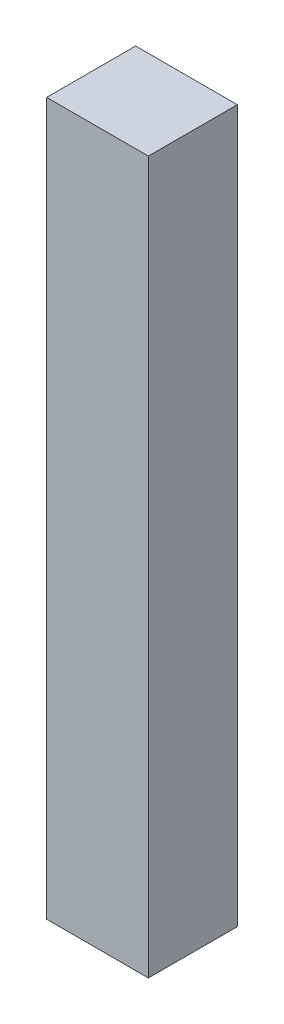
ISO-10303-21;
HEADER;
FILE_DESCRIPTION(('STEP AP214'),'2;1');
FILE_NAME('part.step','',(''),(''),'','','');
FILE_SCHEMA(('AUTOMOTIVE_DESIGN { 1 0 10303 214 1 1 1 1 }'));
ENDSEC;
DATA;
#1=APPLICATION_CONTEXT('core data for automotive mechanical design processes');
#2=APPLICATION_PROTOCOL_DEFINITION('international standard','automotive_design',2000,#1);
#3=PRODUCT_CONTEXT('',#1,'mechanical');
#4=PRODUCT('Part','Part','',(#3));
#5=PRODUCT_RELATED_PRODUCT_CATEGORY('part','',(#4));
#6=PRODUCT_DEFINITION_FORMATION('','',#4);
#7=PRODUCT_DEFINITION_CONTEXT('part definition',#1,'design');
#8=PRODUCT_DEFINITION('design','',#6,#7);
#9=PRODUCT_DEFINITION_SHAPE('','',#8);
#10=(LENGTH_UNIT() NAMED_UNIT(*) SI_UNIT(.MILLI.,.METRE.));
#11=(NAMED_UNIT(*) PLANE_ANGLE_UNIT() SI_UNIT($,.RADIAN.));
#12=(NAMED_UNIT(*) SI_UNIT($,.STERADIAN.) SOLID_ANGLE_UNIT());
#13=UNCERTAINTY_MEASURE_WITH_UNIT(LENGTH_MEASURE(1.E-05),#10,'distance_accuracy_value','');
#14=(GEOMETRIC_REPRESENTATION_CONTEXT(3) GLOBAL_UNCERTAINTY_ASSIGNED_CONTEXT((#13)) GLOBAL_UNIT_ASSIGNED_CONTEXT((#10,
#11,#12)) REPRESENTATION_CONTEXT('',''));
#15=CARTESIAN_POINT('',(0.,0.,0.));
#16=DIRECTION('',(0.,0.,1.));
#17=DIRECTION('',(1.,0.,0.));
#18=AXIS2_PLACEMENT_3D('',#15,#16,#17);
#19=CARTESIAN_POINT('',(4.,28.,-3.5));
#20=DIRECTION('',(-1.,0.,0.));
#21=DIRECTION('',(0.,0.,1.));
#22=AXIS2_PLACEMENT_3D('',#19,#20,#21);
#23=PLANE('',#22);
#24=DIRECTION('',(0.,0.,-1.));
#25=VECTOR('',#24,1.);
#26=CARTESIAN_POINT('',(4.,-28.,-3.5));
#27=LINE('',#26,#25);
#28=CARTESIAN_POINT('',(4.,-28.,3.5));
#29=VERTEX_POINT('',#28);
#30=CARTESIAN_POINT('',(4.,-28.,-3.5));
#31=VERTEX_POINT('',#30);
#32=EDGE_CURVE('E96',#29,#31,#27,.T.);
#33=ORIENTED_EDGE('',*,*,#32,.T.);
#34=DIRECTION('',(0.,-1.,0.));
#35=VECTOR('',#34,1.);
#36=CARTESIAN_POINT('',(4.,28.,-3.5));
#37=LINE('',#36,#35);
#38=CARTESIAN_POINT('',(4.,28.,-3.5));
#39=VERTEX_POINT('',#38);
#40=EDGE_CURVE('E11',#39,#31,#37,.T.);
#41=ORIENTED_EDGE('',*,*,#40,.F.);
#42=DIRECTION('',(0.,0.,-1.));
#43=VECTOR('',#42,1.);
#44=CARTESIAN_POINT('',(4.,28.,-3.5));
#45=LINE('',#44,#43);
#46=CARTESIAN_POINT('',(4.,28.,3.5));
#47=VERTEX_POINT('',#46);
#48=EDGE_CURVE('E84',#47,#39,#45,.T.);
#49=ORIENTED_EDGE('',*,*,#48,.F.);
#50=DIRECTION('',(0.,-1.,0.));
#51=VECTOR('',#50,1.);
#52=CARTESIAN_POINT('',(4.,28.,3.5));
#53=LINE('',#52,#51);
#54=EDGE_CURVE('E92',#47,#29,#53,.T.);
#55=ORIENTED_EDGE('',*,*,#54,.T.);
#56=EDGE_LOOP('',(#33,#41,#49,#55));
#57=FACE_BOUND('',#56,.T.);
#58=ADVANCED_FACE('F33',(#57),#23,.F.);
#59=CARTESIAN_POINT('',(-4.,28.,-3.5));
#60=DIRECTION('',(0.,0.,1.));
#61=DIRECTION('',(1.,0.,0.));
#62=AXIS2_PLACEMENT_3D('',#59,#60,#61);
#63=PLANE('',#62);
#64=DIRECTION('',(-1.,0.,0.));
#65=VECTOR('',#64,1.);
#66=CARTESIAN_POINT('',(-4.,-28.,-3.5));
#67=LINE('',#66,#65);
#68=CARTESIAN_POINT('',(-4.,-28.,-3.5));
#69=VERTEX_POINT('',#68);
#70=EDGE_CURVE('E88',#31,#69,#67,.T.);
#71=ORIENTED_EDGE('',*,*,#70,.T.);
#72=DIRECTION('',(0.,-1.,0.));
#73=VECTOR('',#72,1.);
#74=CARTESIAN_POINT('',(-4.,28.,-3.5));
#75=LINE('',#74,#73);
#76=CARTESIAN_POINT('',(-4.,28.,-3.5));
#77=VERTEX_POINT('',#76);
#78=EDGE_CURVE('E41',#77,#69,#75,.T.);
#79=ORIENTED_EDGE('',*,*,#78,.F.);
#80=DIRECTION('',(-1.,0.,0.));
#81=VECTOR('',#80,1.);
#82=CARTESIAN_POINT('',(-4.,28.,-3.5));
#83=LINE('',#82,#81);
#84=EDGE_CURVE('E79',#39,#77,#83,.T.);
#85=ORIENTED_EDGE('',*,*,#84,.F.);
#86=ORIENTED_EDGE('',*,*,#40,.T.);
#87=EDGE_LOOP('',(#71,#79,#85,#86));
#88=FACE_BOUND('',#87,.T.);
#89=ADVANCED_FACE('F87',(#88),#63,.F.);
#90=CARTESIAN_POINT('',(-4.,28.,-3.5));
#91=DIRECTION('',(1.,0.,0.));
#92=DIRECTION('',(0.,0.,-1.));
#93=AXIS2_PLACEMENT_3D('',#90,#91,#92);
#94=PLANE('',#93);
#95=DIRECTION('',(0.,0.,1.));
#96=VECTOR('',#95,1.);
#97=CARTESIAN_POINT('',(-4.,-28.,-3.5));
#98=LINE('',#97,#96);
#99=CARTESIAN_POINT('',(-4.,-28.,3.5));
#100=VERTEX_POINT('',#99);
#101=EDGE_CURVE('E66',#69,#100,#98,.T.);
#102=ORIENTED_EDGE('',*,*,#101,.T.);
#103=DIRECTION('',(0.,-1.,0.));
#104=VECTOR('',#103,1.);
#105=CARTESIAN_POINT('',(-4.,28.,3.5));
#106=LINE('',#105,#104);
#107=CARTESIAN_POINT('',(-4.,28.,3.5));
#108=VERTEX_POINT('',#107);
#109=EDGE_CURVE('E89',#108,#100,#106,.T.);
#110=ORIENTED_EDGE('',*,*,#109,.F.);
#111=DIRECTION('',(0.,0.,1.));
#112=VECTOR('',#111,1.);
#113=CARTESIAN_POINT('',(-4.,28.,-3.5));
#114=LINE('',#113,#112);
#115=EDGE_CURVE('E82',#77,#108,#114,.T.);
#116=ORIENTED_EDGE('',*,*,#115,.F.);
#117=ORIENTED_EDGE('',*,*,#78,.T.);
#118=EDGE_LOOP('',(#102,#110,#116,#117));
#119=FACE_BOUND('',#118,.T.);
#120=ADVANCED_FACE('F90',(#119),#94,.F.);
#121=CARTESIAN_POINT('',(-4.,28.,3.5));
#122=DIRECTION('',(0.,0.,-1.));
#123=DIRECTION('',(-1.,0.,0.));
#124=AXIS2_PLACEMENT_3D('',#121,#122,#123);
#125=PLANE('',#124);
#126=DIRECTION('',(1.,0.,0.));
#127=VECTOR('',#126,1.);
#128=CARTESIAN_POINT('',(-4.,-28.,3.5));
#129=LINE('',#128,#127);
#130=EDGE_CURVE('E72',#100,#29,#129,.T.);
#131=ORIENTED_EDGE('',*,*,#130,.T.);
#132=ORIENTED_EDGE('',*,*,#54,.F.);
#133=DIRECTION('',(1.,0.,0.));
#134=VECTOR('',#133,1.);
#135=CARTESIAN_POINT('',(-4.,28.,3.5));
#136=LINE('',#135,#134);
#137=EDGE_CURVE('E49',#108,#47,#136,.T.);
#138=ORIENTED_EDGE('',*,*,#137,.F.);
#139=ORIENTED_EDGE('',*,*,#109,.T.);
#140=EDGE_LOOP('',(#131,#132,#138,#139));
#141=FACE_BOUND('',#140,.T.);
#142=ADVANCED_FACE('F103',(#141),#125,.F.);
#143=CARTESIAN_POINT('',(0.,28.,0.));
#144=DIRECTION('',(0.,1.,0.));
#145=DIRECTION('',(0.,0.,1.));
#146=AXIS2_PLACEMENT_3D('',#143,#144,#145);
#147=PLANE('',#146);
#148=ORIENTED_EDGE('',*,*,#48,.T.);
#149=ORIENTED_EDGE('',*,*,#84,.T.);
#150=ORIENTED_EDGE('',*,*,#115,.T.);
#151=ORIENTED_EDGE('',*,*,#137,.T.);
#152=EDGE_LOOP('',(#148,#149,#150,#151));
#153=FACE_BOUND('',#152,.T.);
#154=ADVANCED_FACE('F80',(#153),#147,.T.);
#155=CARTESIAN_POINT('',(0.,-28.,0.));
#156=DIRECTION('',(0.,1.,0.));
#157=DIRECTION('',(0.,0.,1.));
#158=AXIS2_PLACEMENT_3D('',#155,#156,#157);
#159=PLANE('',#158);
#160=ORIENTED_EDGE('',*,*,#32,.F.);
#161=ORIENTED_EDGE('',*,*,#130,.F.);
#162=ORIENTED_EDGE('',*,*,#101,.F.);
#163=ORIENTED_EDGE('',*,*,#70,.F.);
#164=EDGE_LOOP('',(#160,#161,#162,#163));
#165=FACE_BOUND('',#164,.T.);
#166=ADVANCED_FACE('F106',(#165),#159,.F.);
#167=CLOSED_SHELL('',(#58,#89,#120,#142,#154,#166));
#168=MANIFOLD_SOLID_BREP('B2',#167);
#169=ADVANCED_BREP_SHAPE_REPRESENTATION('',(#18,#168),#14);
#170=SHAPE_DEFINITION_REPRESENTATION(#9,#169);
ENDSEC;
END-ISO-10303-21;
